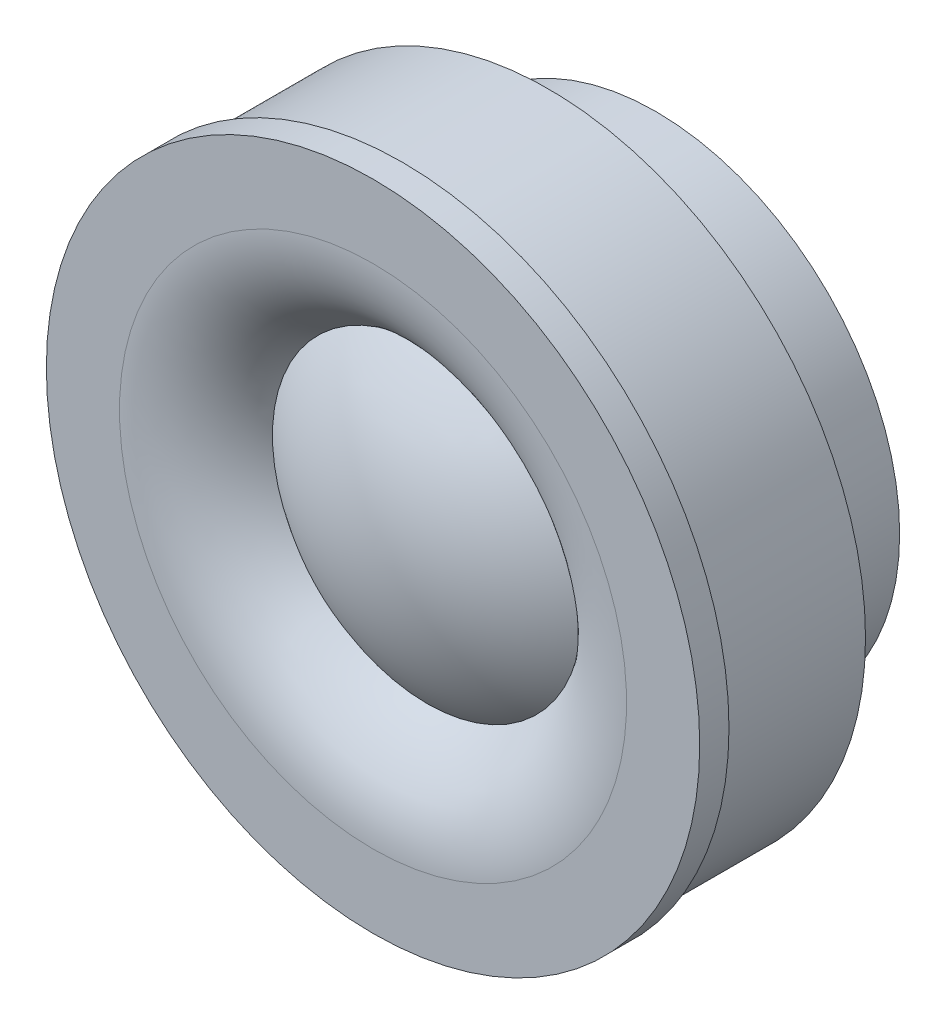
ISO-10303-21;
HEADER;
FILE_DESCRIPTION(('STEP AP214'),'2;1');
FILE_NAME('part.step','',(''),(''),'','','');
FILE_SCHEMA(('AUTOMOTIVE_DESIGN { 1 0 10303 214 1 1 1 1 }'));
ENDSEC;
DATA;
#1=APPLICATION_CONTEXT('core data for automotive mechanical design processes');
#2=APPLICATION_PROTOCOL_DEFINITION('international standard','automotive_design',2000,#1);
#3=PRODUCT_CONTEXT('',#1,'mechanical');
#4=PRODUCT('Part','Part','',(#3));
#5=PRODUCT_RELATED_PRODUCT_CATEGORY('part','',(#4));
#6=PRODUCT_DEFINITION_FORMATION('','',#4);
#7=PRODUCT_DEFINITION_CONTEXT('part definition',#1,'design');
#8=PRODUCT_DEFINITION('design','',#6,#7);
#9=PRODUCT_DEFINITION_SHAPE('','',#8);
#10=(LENGTH_UNIT() NAMED_UNIT(*) SI_UNIT(.MILLI.,.METRE.));
#11=(NAMED_UNIT(*) PLANE_ANGLE_UNIT() SI_UNIT($,.RADIAN.));
#12=(NAMED_UNIT(*) SI_UNIT($,.STERADIAN.) SOLID_ANGLE_UNIT());
#13=UNCERTAINTY_MEASURE_WITH_UNIT(LENGTH_MEASURE(1.E-05),#10,'distance_accuracy_value','');
#14=(GEOMETRIC_REPRESENTATION_CONTEXT(3) GLOBAL_UNCERTAINTY_ASSIGNED_CONTEXT((#13)) GLOBAL_UNIT_ASSIGNED_CONTEXT((#10,
#11,#12)) REPRESENTATION_CONTEXT('',''));
#15=CARTESIAN_POINT('',(0.,0.,0.));
#16=DIRECTION('',(0.,0.,1.));
#17=DIRECTION('',(1.,0.,0.));
#18=AXIS2_PLACEMENT_3D('',#15,#16,#17);
#19=CARTESIAN_POINT('',(0.,0.,-9.));
#20=DIRECTION('',(0.,0.,1.));
#21=DIRECTION('',(1.,0.,0.));
#22=AXIS2_PLACEMENT_3D('',#19,#20,#21);
#23=CYLINDRICAL_SURFACE('',#22,16.25);
#24=CARTESIAN_POINT('',(0.,0.,-9.));
#25=DIRECTION('',(0.,0.,1.));
#26=DIRECTION('',(1.,0.,0.));
#27=AXIS2_PLACEMENT_3D('',#24,#25,#26);
#28=CIRCLE('',#27,16.25);
#29=CARTESIAN_POINT('',(16.25,0.,-9.));
#30=VERTEX_POINT('',#29);
#31=EDGE_CURVE('E41',#30,#30,#28,.T.);
#32=ORIENTED_EDGE('',*,*,#31,.T.);
#33=EDGE_LOOP('',(#32));
#34=FACE_BOUND('',#33,.T.);
#35=CARTESIAN_POINT('',(0.,0.,-1.5));
#36=DIRECTION('',(0.,0.,1.));
#37=DIRECTION('',(1.,0.,0.));
#38=AXIS2_PLACEMENT_3D('',#35,#36,#37);
#39=CIRCLE('',#38,16.25);
#40=CARTESIAN_POINT('',(16.25,0.,-1.5));
#41=VERTEX_POINT('',#40);
#42=EDGE_CURVE('E37',#41,#41,#39,.F.);
#43=ORIENTED_EDGE('',*,*,#42,.T.);
#44=EDGE_LOOP('',(#43));
#45=FACE_BOUND('',#44,.T.);
#46=ADVANCED_FACE('F34',(#34,#45),#23,.T.);
#47=CARTESIAN_POINT('',(0.,0.,-9.));
#48=DIRECTION('',(0.,0.,1.));
#49=DIRECTION('',(1.,0.,0.));
#50=AXIS2_PLACEMENT_3D('',#47,#48,#49);
#51=PLANE('',#50);
#52=CARTESIAN_POINT('',(0.,0.,-9.));
#53=DIRECTION('',(0.,0.,-1.));
#54=DIRECTION('',(-1.,0.,0.));
#55=AXIS2_PLACEMENT_3D('',#52,#53,#54);
#56=CIRCLE('',#55,12.5);
#57=CARTESIAN_POINT('',(-12.5,0.,-9.));
#58=VERTEX_POINT('',#57);
#59=EDGE_CURVE('E12',#58,#58,#56,.T.);
#60=ORIENTED_EDGE('',*,*,#59,.F.);
#61=EDGE_LOOP('',(#60));
#62=FACE_BOUND('',#61,.T.);
#63=ORIENTED_EDGE('',*,*,#31,.F.);
#64=EDGE_LOOP('',(#63));
#65=FACE_BOUND('',#64,.T.);
#66=ADVANCED_FACE('F72',(#62,#65),#51,.F.);
#67=CARTESIAN_POINT('',(0.,0.,-64.3553390593274));
#68=DIRECTION('',(0.,0.,1.));
#69=DIRECTION('',(1.,0.,0.));
#70=AXIS2_PLACEMENT_3D('',#67,#68,#69);
#71=CYLINDRICAL_SURFACE('',#70,12.5);
#72=CARTESIAN_POINT('',(0.,0.,-14.5));
#73=DIRECTION('',(0.,0.,1.));
#74=DIRECTION('',(1.,0.,0.));
#75=AXIS2_PLACEMENT_3D('',#72,#73,#74);
#76=CIRCLE('',#75,12.5);
#77=CARTESIAN_POINT('',(12.5,0.,-14.5));
#78=VERTEX_POINT('',#77);
#79=EDGE_CURVE('E65',#78,#78,#76,.T.);
#80=ORIENTED_EDGE('',*,*,#79,.T.);
#81=EDGE_LOOP('',(#80));
#82=FACE_BOUND('',#81,.T.);
#83=ORIENTED_EDGE('',*,*,#59,.T.);
#84=EDGE_LOOP('',(#83));
#85=FACE_BOUND('',#84,.T.);
#86=ADVANCED_FACE('F74',(#82,#85),#71,.T.);
#87=CARTESIAN_POINT('',(0.,0.,-14.5));
#88=DIRECTION('',(0.,0.,1.));
#89=DIRECTION('',(1.,0.,0.));
#90=AXIS2_PLACEMENT_3D('',#87,#88,#89);
#91=PLANE('',#90);
#92=ORIENTED_EDGE('',*,*,#79,.F.);
#93=EDGE_LOOP('',(#92));
#94=FACE_BOUND('',#93,.T.);
#95=ADVANCED_FACE('F81',(#94),#91,.F.);
#96=CARTESIAN_POINT('',(0.,0.,-1.5));
#97=DIRECTION('',(0.,0.,1.));
#98=DIRECTION('',(1.,0.,0.));
#99=AXIS2_PLACEMENT_3D('',#96,#97,#98);
#100=CYLINDRICAL_SURFACE('',#99,16.75);
#101=CARTESIAN_POINT('',(0.,0.,-1.5));
#102=DIRECTION('',(0.,0.,1.));
#103=DIRECTION('',(1.,0.,0.));
#104=AXIS2_PLACEMENT_3D('',#101,#102,#103);
#105=CIRCLE('',#104,16.75);
#106=CARTESIAN_POINT('',(16.75,0.,-1.5));
#107=VERTEX_POINT('',#106);
#108=EDGE_CURVE('E60',#107,#107,#105,.T.);
#109=ORIENTED_EDGE('',*,*,#108,.T.);
#110=EDGE_LOOP('',(#109));
#111=FACE_BOUND('',#110,.T.);
#112=CARTESIAN_POINT('',(0.,0.,0.));
#113=DIRECTION('',(0.,0.,1.));
#114=DIRECTION('',(1.,0.,0.));
#115=AXIS2_PLACEMENT_3D('',#112,#113,#114);
#116=CIRCLE('',#115,16.75);
#117=CARTESIAN_POINT('',(16.75,0.,0.));
#118=VERTEX_POINT('',#117);
#119=EDGE_CURVE('E57',#118,#118,#116,.T.);
#120=ORIENTED_EDGE('',*,*,#119,.F.);
#121=EDGE_LOOP('',(#120));
#122=FACE_BOUND('',#121,.T.);
#123=ADVANCED_FACE('F96',(#111,#122),#100,.T.);
#124=CARTESIAN_POINT('',(0.,0.,-1.5));
#125=DIRECTION('',(0.,0.,1.));
#126=DIRECTION('',(1.,0.,0.));
#127=AXIS2_PLACEMENT_3D('',#124,#125,#126);
#128=PLANE('',#127);
#129=ORIENTED_EDGE('',*,*,#42,.F.);
#130=EDGE_LOOP('',(#129));
#131=FACE_BOUND('',#130,.T.);
#132=ORIENTED_EDGE('',*,*,#108,.F.);
#133=EDGE_LOOP('',(#132));
#134=FACE_BOUND('',#133,.T.);
#135=ADVANCED_FACE('F88',(#131,#134),#128,.F.);
#136=CARTESIAN_POINT('',(0.,0.,0.));
#137=DIRECTION('',(0.,0.,1.));
#138=DIRECTION('',(1.,0.,0.));
#139=AXIS2_PLACEMENT_3D('',#136,#137,#138);
#140=PLANE('',#139);
#141=CARTESIAN_POINT('',(0.,0.,0.));
#142=DIRECTION('',(0.,0.,1.));
#143=DIRECTION('',(0.,-1.,0.));
#144=AXIS2_PLACEMENT_3D('',#141,#142,#143);
#145=CIRCLE('',#144,13.);
#146=CARTESIAN_POINT('',(0.,-13.,0.));
#147=VERTEX_POINT('',#146);
#148=EDGE_CURVE('E54',#147,#147,#145,.T.);
#149=ORIENTED_EDGE('',*,*,#148,.F.);
#150=EDGE_LOOP('',(#149));
#151=FACE_BOUND('',#150,.T.);
#152=ORIENTED_EDGE('',*,*,#119,.T.);
#153=EDGE_LOOP('',(#152));
#154=FACE_BOUND('',#153,.T.);
#155=ADVANCED_FACE('F86',(#151,#154),#140,.T.);
#156=CARTESIAN_POINT('',(0.,0.,-6.));
#157=DIRECTION('',(0.,0.,1.));
#158=DIRECTION('',(0.,-1.,0.));
#159=AXIS2_PLACEMENT_3D('',#156,#157,#158);
#160=TOROIDAL_SURFACE('',#159,13.,6.);
#161=ORIENTED_EDGE('',*,*,#148,.T.);
#162=EDGE_LOOP('',(#161));
#163=FACE_BOUND('',#162,.T.);
#164=CARTESIAN_POINT('',(0.,0.,-2.77958174300294));
#165=DIRECTION('',(0.,0.,1.));
#166=DIRECTION('',(0.,-1.,0.));
#167=AXIS2_PLACEMENT_3D('',#164,#165,#166);
#168=CIRCLE('',#167,7.9375);
#169=CARTESIAN_POINT('',(0.,-7.9375,-2.77958174300294));
#170=VERTEX_POINT('',#169);
#171=EDGE_CURVE('E52',#170,#170,#168,.T.);
#172=ORIENTED_EDGE('',*,*,#171,.F.);
#173=EDGE_LOOP('',(#172));
#174=FACE_BOUND('',#173,.T.);
#175=ADVANCED_FACE('F48',(#163,#174),#160,.T.);
#176=CARTESIAN_POINT('',(0.,0.,-12.7231338121436));
#177=DIRECTION('',(0.,0.,1.));
#178=DIRECTION('',(0.,-1.,0.));
#179=AXIS2_PLACEMENT_3D('',#176,#177,#178);
#180=SPHERICAL_SURFACE('',#179,12.7231338121436);
#181=CARTESIAN_POINT('',(0.,0.,0.));
#182=VERTEX_POINT('',#181);
#183=VERTEX_LOOP('',#182);
#184=FACE_BOUND('',#183,.T.);
#185=ORIENTED_EDGE('',*,*,#171,.T.);
#186=EDGE_LOOP('',(#185));
#187=FACE_BOUND('',#186,.T.);
#188=ADVANCED_FACE('F45',(#184,#187),#180,.T.);
#189=CLOSED_SHELL('',(#46,#66,#86,#95,#123,#135,#155,#175,#188));
#190=MANIFOLD_SOLID_BREP('B2',#189);
#191=ADVANCED_BREP_SHAPE_REPRESENTATION('',(#18,#190),#14);
#192=SHAPE_DEFINITION_REPRESENTATION(#9,#191);
ENDSEC;
END-ISO-10303-21;
